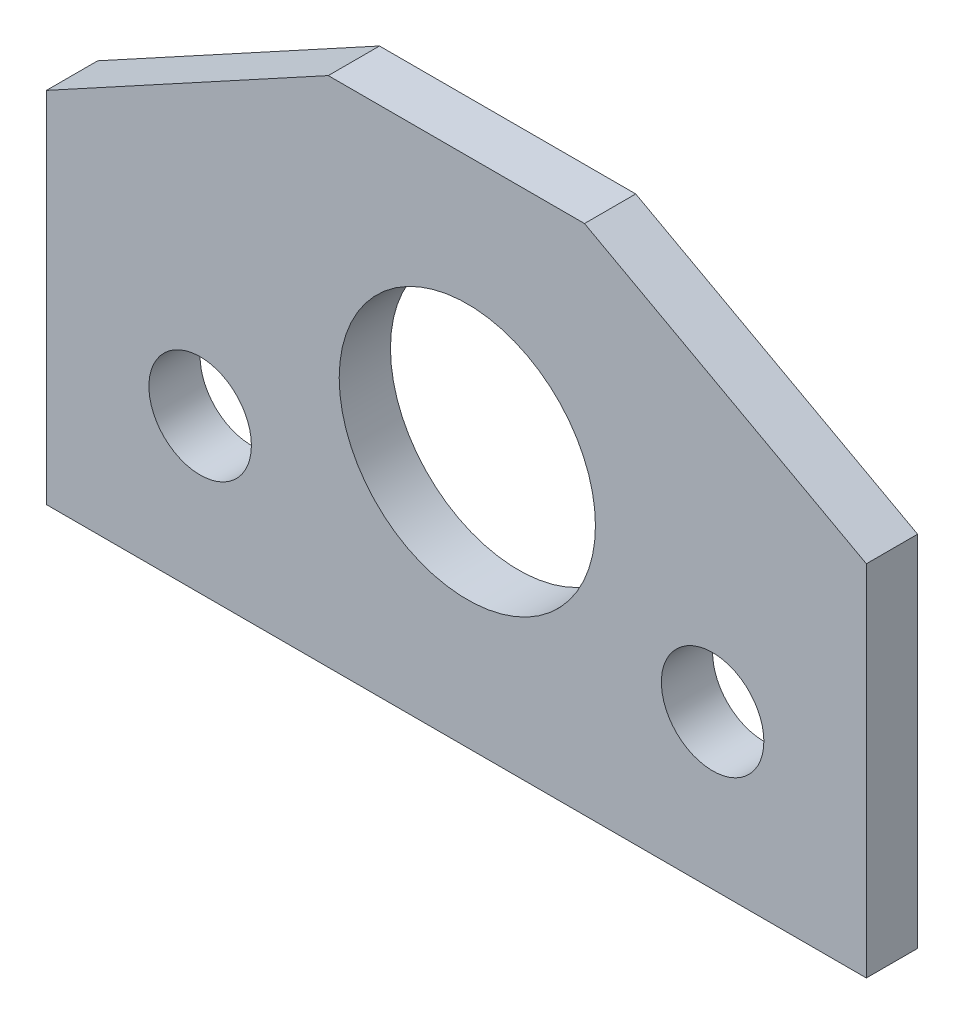
ISO-10303-21;
HEADER;
FILE_DESCRIPTION(('STEP AP214'),'2;1');
FILE_NAME('part.step','',(''),(''),'','','');
FILE_SCHEMA(('AUTOMOTIVE_DESIGN { 1 0 10303 214 1 1 1 1 }'));
ENDSEC;
DATA;
#1=APPLICATION_CONTEXT('core data for automotive mechanical design processes');
#2=APPLICATION_PROTOCOL_DEFINITION('international standard','automotive_design',2000,#1);
#3=PRODUCT_CONTEXT('',#1,'mechanical');
#4=PRODUCT('Part','Part','',(#3));
#5=PRODUCT_RELATED_PRODUCT_CATEGORY('part','',(#4));
#6=PRODUCT_DEFINITION_FORMATION('','',#4);
#7=PRODUCT_DEFINITION_CONTEXT('part definition',#1,'design');
#8=PRODUCT_DEFINITION('design','',#6,#7);
#9=PRODUCT_DEFINITION_SHAPE('','',#8);
#10=(LENGTH_UNIT() NAMED_UNIT(*) SI_UNIT(.MILLI.,.METRE.));
#11=(NAMED_UNIT(*) PLANE_ANGLE_UNIT() SI_UNIT($,.RADIAN.));
#12=(NAMED_UNIT(*) SI_UNIT($,.STERADIAN.) SOLID_ANGLE_UNIT());
#13=UNCERTAINTY_MEASURE_WITH_UNIT(LENGTH_MEASURE(1.E-05),#10,'distance_accuracy_value','');
#14=(GEOMETRIC_REPRESENTATION_CONTEXT(3) GLOBAL_UNCERTAINTY_ASSIGNED_CONTEXT((#13)) GLOBAL_UNIT_ASSIGNED_CONTEXT((#10,
#11,#12)) REPRESENTATION_CONTEXT('',''));
#15=CARTESIAN_POINT('',(0.,0.,0.));
#16=DIRECTION('',(0.,0.,1.));
#17=DIRECTION('',(1.,0.,0.));
#18=AXIS2_PLACEMENT_3D('',#15,#16,#17);
#19=CARTESIAN_POINT('',(-100.592548076923,-25.2931490384615,6.35));
#20=DIRECTION('',(-1.,0.,0.));
#21=DIRECTION('',(0.,0.,1.));
#22=AXIS2_PLACEMENT_3D('',#19,#20,#21);
#23=PLANE('',#22);
#24=DIRECTION('',(0.,1.,0.));
#25=VECTOR('',#24,1.);
#26=CARTESIAN_POINT('',(-100.592548076923,-25.2931490384615,0.));
#27=LINE('',#26,#25);
#28=CARTESIAN_POINT('',(-100.592548076923,-25.2931490384615,0.));
#29=VERTEX_POINT('',#28);
#30=CARTESIAN_POINT('',(-100.592548076923,19.1568509615385,0.));
#31=VERTEX_POINT('',#30);
#32=EDGE_CURVE('E130',#29,#31,#27,.T.);
#33=ORIENTED_EDGE('',*,*,#32,.F.);
#34=DIRECTION('',(0.,0.,-1.));
#35=VECTOR('',#34,1.);
#36=CARTESIAN_POINT('',(-100.592548076923,-25.2931490384615,6.35));
#37=LINE('',#36,#35);
#38=CARTESIAN_POINT('',(-100.592548076923,-25.2931490384615,6.35));
#39=VERTEX_POINT('',#38);
#40=EDGE_CURVE('E11',#39,#29,#37,.T.);
#41=ORIENTED_EDGE('',*,*,#40,.F.);
#42=DIRECTION('',(0.,1.,0.));
#43=VECTOR('',#42,1.);
#44=CARTESIAN_POINT('',(-100.592548076923,-25.2931490384615,6.35));
#45=LINE('',#44,#43);
#46=CARTESIAN_POINT('',(-100.592548076923,19.1568509615385,6.35));
#47=VERTEX_POINT('',#46);
#48=EDGE_CURVE('E151',#39,#47,#45,.T.);
#49=ORIENTED_EDGE('',*,*,#48,.T.);
#50=DIRECTION('',(0.,0.,-1.));
#51=VECTOR('',#50,1.);
#52=CARTESIAN_POINT('',(-100.592548076923,19.1568509615385,6.35));
#53=LINE('',#52,#51);
#54=EDGE_CURVE('E42',#47,#31,#53,.T.);
#55=ORIENTED_EDGE('',*,*,#54,.T.);
#56=EDGE_LOOP('',(#33,#41,#49,#55));
#57=FACE_BOUND('',#56,.T.);
#58=ADVANCED_FACE('F39',(#57),#23,.T.);
#59=CARTESIAN_POINT('',(1.0074519230769,-25.2931490384615,6.35));
#60=DIRECTION('',(0.,-1.,0.));
#61=DIRECTION('',(1.,0.,0.));
#62=AXIS2_PLACEMENT_3D('',#59,#60,#61);
#63=PLANE('',#62);
#64=DIRECTION('',(-1.,0.,0.));
#65=VECTOR('',#64,1.);
#66=CARTESIAN_POINT('',(1.0074519230769,-25.2931490384615,0.));
#67=LINE('',#66,#65);
#68=CARTESIAN_POINT('',(1.0074519230769,-25.2931490384615,0.));
#69=VERTEX_POINT('',#68);
#70=EDGE_CURVE('E148',#69,#29,#67,.T.);
#71=ORIENTED_EDGE('',*,*,#70,.F.);
#72=DIRECTION('',(0.,0.,-1.));
#73=VECTOR('',#72,1.);
#74=CARTESIAN_POINT('',(1.0074519230769,-25.2931490384615,6.35));
#75=LINE('',#74,#73);
#76=CARTESIAN_POINT('',(1.0074519230769,-25.2931490384615,6.35));
#77=VERTEX_POINT('',#76);
#78=EDGE_CURVE('E49',#77,#69,#75,.T.);
#79=ORIENTED_EDGE('',*,*,#78,.F.);
#80=DIRECTION('',(-1.,0.,0.));
#81=VECTOR('',#80,1.);
#82=CARTESIAN_POINT('',(1.0074519230769,-25.2931490384615,6.35));
#83=LINE('',#82,#81);
#84=EDGE_CURVE('E116',#77,#39,#83,.T.);
#85=ORIENTED_EDGE('',*,*,#84,.T.);
#86=ORIENTED_EDGE('',*,*,#40,.T.);
#87=EDGE_LOOP('',(#71,#79,#85,#86));
#88=FACE_BOUND('',#87,.T.);
#89=ADVANCED_FACE('F163',(#88),#63,.T.);
#90=CARTESIAN_POINT('',(1.00745192307689,19.1568509615385,6.35));
#91=DIRECTION('',(1.,0.,0.));
#92=DIRECTION('',(0.,1.,0.));
#93=AXIS2_PLACEMENT_3D('',#90,#91,#92);
#94=PLANE('',#93);
#95=DIRECTION('',(0.,-1.,0.));
#96=VECTOR('',#95,1.);
#97=CARTESIAN_POINT('',(1.00745192307689,19.1568509615385,0.));
#98=LINE('',#97,#96);
#99=CARTESIAN_POINT('',(1.00745192307689,19.1568509615385,0.));
#100=VERTEX_POINT('',#99);
#101=EDGE_CURVE('E102',#100,#69,#98,.T.);
#102=ORIENTED_EDGE('',*,*,#101,.F.);
#103=DIRECTION('',(0.,0.,-1.));
#104=VECTOR('',#103,1.);
#105=CARTESIAN_POINT('',(1.00745192307689,19.1568509615385,6.35));
#106=LINE('',#105,#104);
#107=CARTESIAN_POINT('',(1.00745192307689,19.1568509615385,6.35));
#108=VERTEX_POINT('',#107);
#109=EDGE_CURVE('E97',#108,#100,#106,.T.);
#110=ORIENTED_EDGE('',*,*,#109,.F.);
#111=DIRECTION('',(0.,-1.,0.));
#112=VECTOR('',#111,1.);
#113=CARTESIAN_POINT('',(1.00745192307689,19.1568509615385,6.35));
#114=LINE('',#113,#112);
#115=EDGE_CURVE('E100',#108,#77,#114,.T.);
#116=ORIENTED_EDGE('',*,*,#115,.T.);
#117=ORIENTED_EDGE('',*,*,#78,.T.);
#118=EDGE_LOOP('',(#102,#110,#116,#117));
#119=FACE_BOUND('',#118,.T.);
#120=ADVANCED_FACE('F99',(#119),#94,.T.);
#121=CARTESIAN_POINT('',(-33.9175480769231,38.2068509615385,6.35));
#122=DIRECTION('',(0.478852130680573,0.877895572914384,0.));
#123=DIRECTION('',(-0.877895572914384,0.478852130680573,0.));
#124=AXIS2_PLACEMENT_3D('',#121,#122,#123);
#125=PLANE('',#124);
#126=DIRECTION('',(0.877895572914384,-0.478852130680573,0.));
#127=VECTOR('',#126,1.);
#128=CARTESIAN_POINT('',(-33.9175480769231,38.2068509615385,0.));
#129=LINE('',#128,#127);
#130=CARTESIAN_POINT('',(-33.9175480769231,38.2068509615385,0.));
#131=VERTEX_POINT('',#130);
#132=EDGE_CURVE('E143',#131,#100,#129,.T.);
#133=ORIENTED_EDGE('',*,*,#132,.F.);
#134=DIRECTION('',(0.,0.,-1.));
#135=VECTOR('',#134,1.);
#136=CARTESIAN_POINT('',(-33.9175480769231,38.2068509615385,6.35));
#137=LINE('',#136,#135);
#138=CARTESIAN_POINT('',(-33.9175480769231,38.2068509615385,6.35));
#139=VERTEX_POINT('',#138);
#140=EDGE_CURVE('E108',#139,#131,#137,.T.);
#141=ORIENTED_EDGE('',*,*,#140,.F.);
#142=DIRECTION('',(0.877895572914384,-0.478852130680573,0.));
#143=VECTOR('',#142,1.);
#144=CARTESIAN_POINT('',(-33.9175480769231,38.2068509615385,6.35));
#145=LINE('',#144,#143);
#146=EDGE_CURVE('E114',#139,#108,#145,.T.);
#147=ORIENTED_EDGE('',*,*,#146,.T.);
#148=ORIENTED_EDGE('',*,*,#109,.T.);
#149=EDGE_LOOP('',(#133,#141,#147,#148));
#150=FACE_BOUND('',#149,.T.);
#151=ADVANCED_FACE('F119',(#150),#125,.T.);
#152=CARTESIAN_POINT('',(-65.6675480769231,38.2068509615385,6.35));
#153=DIRECTION('',(0.,1.,0.));
#154=DIRECTION('',(0.,0.,1.));
#155=AXIS2_PLACEMENT_3D('',#152,#153,#154);
#156=PLANE('',#155);
#157=DIRECTION('',(1.,0.,0.));
#158=VECTOR('',#157,1.);
#159=CARTESIAN_POINT('',(-65.6675480769231,38.2068509615385,0.));
#160=LINE('',#159,#158);
#161=CARTESIAN_POINT('',(-65.6675480769231,38.2068509615385,0.));
#162=VERTEX_POINT('',#161);
#163=EDGE_CURVE('E139',#162,#131,#160,.T.);
#164=ORIENTED_EDGE('',*,*,#163,.F.);
#165=DIRECTION('',(0.,0.,-1.));
#166=VECTOR('',#165,1.);
#167=CARTESIAN_POINT('',(-65.6675480769231,38.2068509615385,6.35));
#168=LINE('',#167,#166);
#169=CARTESIAN_POINT('',(-65.6675480769231,38.2068509615385,6.35));
#170=VERTEX_POINT('',#169);
#171=EDGE_CURVE('E156',#170,#162,#168,.T.);
#172=ORIENTED_EDGE('',*,*,#171,.F.);
#173=DIRECTION('',(1.,0.,0.));
#174=VECTOR('',#173,1.);
#175=CARTESIAN_POINT('',(-65.6675480769231,38.2068509615385,6.35));
#176=LINE('',#175,#174);
#177=EDGE_CURVE('E121',#170,#139,#176,.T.);
#178=ORIENTED_EDGE('',*,*,#177,.T.);
#179=ORIENTED_EDGE('',*,*,#140,.T.);
#180=EDGE_LOOP('',(#164,#172,#178,#179));
#181=FACE_BOUND('',#180,.T.);
#182=ADVANCED_FACE('F176',(#181),#156,.T.);
#183=CARTESIAN_POINT('',(-100.592548076923,19.1568509615385,6.35));
#184=DIRECTION('',(-0.478852130680573,0.877895572914384,0.));
#185=DIRECTION('',(-0.877895572914384,-0.478852130680573,0.));
#186=AXIS2_PLACEMENT_3D('',#183,#184,#185);
#187=PLANE('',#186);
#188=DIRECTION('',(0.877895572914384,0.478852130680573,0.));
#189=VECTOR('',#188,1.);
#190=CARTESIAN_POINT('',(-100.592548076923,19.1568509615385,0.));
#191=LINE('',#190,#189);
#192=EDGE_CURVE('E134',#31,#162,#191,.T.);
#193=ORIENTED_EDGE('',*,*,#192,.F.);
#194=ORIENTED_EDGE('',*,*,#54,.F.);
#195=DIRECTION('',(0.877895572914384,0.478852130680573,0.));
#196=VECTOR('',#195,1.);
#197=CARTESIAN_POINT('',(-100.592548076923,19.1568509615385,6.35));
#198=LINE('',#197,#196);
#199=EDGE_CURVE('E124',#47,#170,#198,.T.);
#200=ORIENTED_EDGE('',*,*,#199,.T.);
#201=ORIENTED_EDGE('',*,*,#171,.T.);
#202=EDGE_LOOP('',(#193,#194,#200,#201));
#203=FACE_BOUND('',#202,.T.);
#204=ADVANCED_FACE('F160',(#203),#187,.T.);
#205=CARTESIAN_POINT('',(0.,0.,6.35));
#206=DIRECTION('',(0.,0.,-1.));
#207=DIRECTION('',(-1.,0.,0.));
#208=AXIS2_PLACEMENT_3D('',#205,#206,#207);
#209=PLANE('',#208);
#210=CARTESIAN_POINT('',(-81.5425480769231,-6.24314903846152,6.35));
#211=DIRECTION('',(0.,0.,1.));
#212=DIRECTION('',(1.,0.,0.));
#213=AXIS2_PLACEMENT_3D('',#210,#211,#212);
#214=CIRCLE('',#213,6.35);
#215=CARTESIAN_POINT('',(-75.1925480769231,-6.24314903846152,6.35));
#216=VERTEX_POINT('',#215);
#217=EDGE_CURVE('E208',#216,#216,#214,.T.);
#218=ORIENTED_EDGE('',*,*,#217,.F.);
#219=EDGE_LOOP('',(#218));
#220=FACE_BOUND('',#219,.T.);
#221=CARTESIAN_POINT('',(-48.4371648510363,6.45685096153848,6.35));
#222=DIRECTION('',(0.,0.,1.));
#223=DIRECTION('',(1.,0.,0.));
#224=AXIS2_PLACEMENT_3D('',#221,#222,#223);
#225=CIRCLE('',#224,15.875);
#226=CARTESIAN_POINT('',(-32.5621648510363,6.45685096153848,6.35));
#227=VERTEX_POINT('',#226);
#228=EDGE_CURVE('E216',#227,#227,#225,.T.);
#229=ORIENTED_EDGE('',*,*,#228,.F.);
#230=EDGE_LOOP('',(#229));
#231=FACE_BOUND('',#230,.T.);
#232=CARTESIAN_POINT('',(-18.0425480769231,-6.24314903846152,6.35));
#233=DIRECTION('',(0.,0.,1.));
#234=DIRECTION('',(1.,0.,0.));
#235=AXIS2_PLACEMENT_3D('',#232,#233,#234);
#236=CIRCLE('',#235,6.35);
#237=CARTESIAN_POINT('',(-11.6925480769231,-6.24314903846152,6.35));
#238=VERTEX_POINT('',#237);
#239=EDGE_CURVE('E226',#238,#238,#236,.T.);
#240=ORIENTED_EDGE('',*,*,#239,.F.);
#241=EDGE_LOOP('',(#240));
#242=FACE_BOUND('',#241,.T.);
#243=ORIENTED_EDGE('',*,*,#48,.F.);
#244=ORIENTED_EDGE('',*,*,#84,.F.);
#245=ORIENTED_EDGE('',*,*,#115,.F.);
#246=ORIENTED_EDGE('',*,*,#146,.F.);
#247=ORIENTED_EDGE('',*,*,#177,.F.);
#248=ORIENTED_EDGE('',*,*,#199,.F.);
#249=EDGE_LOOP('',(#243,#244,#245,#246,#247,#248));
#250=FACE_BOUND('',#249,.T.);
#251=ADVANCED_FACE('F112',(#220,#231,#242,#250),#209,.F.);
#252=CARTESIAN_POINT('',(0.,0.,0.));
#253=DIRECTION('',(0.,0.,-1.));
#254=DIRECTION('',(-1.,0.,0.));
#255=AXIS2_PLACEMENT_3D('',#252,#253,#254);
#256=PLANE('',#255);
#257=CARTESIAN_POINT('',(-81.5425480769231,-6.24314903846152,0.));
#258=DIRECTION('',(0.,0.,1.));
#259=DIRECTION('',(1.,0.,0.));
#260=AXIS2_PLACEMENT_3D('',#257,#258,#259);
#261=CIRCLE('',#260,6.35);
#262=CARTESIAN_POINT('',(-75.1925480769231,-6.24314903846152,0.));
#263=VERTEX_POINT('',#262);
#264=EDGE_CURVE('E135',#263,#263,#261,.T.);
#265=ORIENTED_EDGE('',*,*,#264,.T.);
#266=EDGE_LOOP('',(#265));
#267=FACE_BOUND('',#266,.T.);
#268=CARTESIAN_POINT('',(-48.4371648510363,6.45685096153848,0.));
#269=DIRECTION('',(0.,0.,1.));
#270=DIRECTION('',(1.,0.,0.));
#271=AXIS2_PLACEMENT_3D('',#268,#269,#270);
#272=CIRCLE('',#271,15.875);
#273=CARTESIAN_POINT('',(-32.5621648510363,6.45685096153848,0.));
#274=VERTEX_POINT('',#273);
#275=EDGE_CURVE('E210',#274,#274,#272,.T.);
#276=ORIENTED_EDGE('',*,*,#275,.T.);
#277=EDGE_LOOP('',(#276));
#278=FACE_BOUND('',#277,.T.);
#279=CARTESIAN_POINT('',(-18.0425480769231,-6.24314903846152,0.));
#280=DIRECTION('',(0.,0.,1.));
#281=DIRECTION('',(1.,0.,0.));
#282=AXIS2_PLACEMENT_3D('',#279,#280,#281);
#283=CIRCLE('',#282,6.35);
#284=CARTESIAN_POINT('',(-11.6925480769231,-6.24314903846152,0.));
#285=VERTEX_POINT('',#284);
#286=EDGE_CURVE('E222',#285,#285,#283,.T.);
#287=ORIENTED_EDGE('',*,*,#286,.T.);
#288=EDGE_LOOP('',(#287));
#289=FACE_BOUND('',#288,.T.);
#290=ORIENTED_EDGE('',*,*,#32,.T.);
#291=ORIENTED_EDGE('',*,*,#192,.T.);
#292=ORIENTED_EDGE('',*,*,#163,.T.);
#293=ORIENTED_EDGE('',*,*,#132,.T.);
#294=ORIENTED_EDGE('',*,*,#101,.T.);
#295=ORIENTED_EDGE('',*,*,#70,.T.);
#296=EDGE_LOOP('',(#290,#291,#292,#293,#294,#295));
#297=FACE_BOUND('',#296,.T.);
#298=ADVANCED_FACE('F162',(#267,#278,#289,#297),#256,.T.);
#299=CARTESIAN_POINT('',(-18.0425480769231,-6.24314903846152,0.));
#300=DIRECTION('',(0.,0.,1.));
#301=DIRECTION('',(1.,0.,0.));
#302=AXIS2_PLACEMENT_3D('',#299,#300,#301);
#303=CYLINDRICAL_SURFACE('',#302,6.35);
#304=ORIENTED_EDGE('',*,*,#286,.F.);
#305=EDGE_LOOP('',(#304));
#306=FACE_BOUND('',#305,.T.);
#307=ORIENTED_EDGE('',*,*,#239,.T.);
#308=EDGE_LOOP('',(#307));
#309=FACE_BOUND('',#308,.T.);
#310=ADVANCED_FACE('F187',(#306,#309),#303,.F.);
#311=CARTESIAN_POINT('',(-48.4371648510363,6.45685096153848,0.));
#312=DIRECTION('',(0.,0.,1.));
#313=DIRECTION('',(1.,0.,0.));
#314=AXIS2_PLACEMENT_3D('',#311,#312,#313);
#315=CYLINDRICAL_SURFACE('',#314,15.875);
#316=ORIENTED_EDGE('',*,*,#275,.F.);
#317=EDGE_LOOP('',(#316));
#318=FACE_BOUND('',#317,.T.);
#319=ORIENTED_EDGE('',*,*,#228,.T.);
#320=EDGE_LOOP('',(#319));
#321=FACE_BOUND('',#320,.T.);
#322=ADVANCED_FACE('F194',(#318,#321),#315,.F.);
#323=CARTESIAN_POINT('',(-81.5425480769231,-6.24314903846152,0.));
#324=DIRECTION('',(0.,0.,1.));
#325=DIRECTION('',(1.,0.,0.));
#326=AXIS2_PLACEMENT_3D('',#323,#324,#325);
#327=CYLINDRICAL_SURFACE('',#326,6.35);
#328=ORIENTED_EDGE('',*,*,#264,.F.);
#329=EDGE_LOOP('',(#328));
#330=FACE_BOUND('',#329,.T.);
#331=ORIENTED_EDGE('',*,*,#217,.T.);
#332=EDGE_LOOP('',(#331));
#333=FACE_BOUND('',#332,.T.);
#334=ADVANCED_FACE('F198',(#330,#333),#327,.F.);
#335=CLOSED_SHELL('',(#58,#89,#120,#151,#182,#204,#251,#298,#310,#322,#334));
#336=MANIFOLD_SOLID_BREP('B2',#335);
#337=ADVANCED_BREP_SHAPE_REPRESENTATION('',(#18,#336),#14);
#338=SHAPE_DEFINITION_REPRESENTATION(#9,#337);
ENDSEC;
END-ISO-10303-21;
